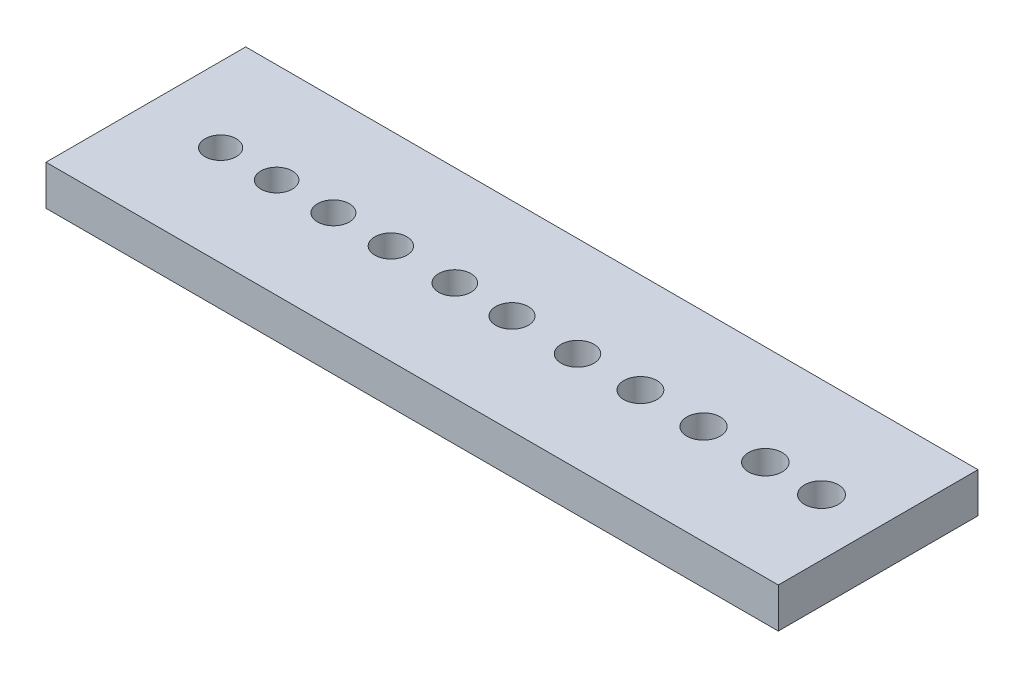
ISO-10303-21;
HEADER;
FILE_DESCRIPTION(('STEP AP214'),'2;1');
FILE_NAME('part.step','',(''),(''),'','','');
FILE_SCHEMA(('AUTOMOTIVE_DESIGN { 1 0 10303 214 1 1 1 1 }'));
ENDSEC;
DATA;
#1=APPLICATION_CONTEXT('core data for automotive mechanical design processes');
#2=APPLICATION_PROTOCOL_DEFINITION('international standard','automotive_design',2000,#1);
#3=PRODUCT_CONTEXT('',#1,'mechanical');
#4=PRODUCT('Part','Part','',(#3));
#5=PRODUCT_RELATED_PRODUCT_CATEGORY('part','',(#4));
#6=PRODUCT_DEFINITION_FORMATION('','',#4);
#7=PRODUCT_DEFINITION_CONTEXT('part definition',#1,'design');
#8=PRODUCT_DEFINITION('design','',#6,#7);
#9=PRODUCT_DEFINITION_SHAPE('','',#8);
#10=(LENGTH_UNIT() NAMED_UNIT(*) SI_UNIT(.MILLI.,.METRE.));
#11=(NAMED_UNIT(*) PLANE_ANGLE_UNIT() SI_UNIT($,.RADIAN.));
#12=(NAMED_UNIT(*) SI_UNIT($,.STERADIAN.) SOLID_ANGLE_UNIT());
#13=UNCERTAINTY_MEASURE_WITH_UNIT(LENGTH_MEASURE(1.E-05),#10,'distance_accuracy_value','');
#14=(GEOMETRIC_REPRESENTATION_CONTEXT(3) GLOBAL_UNCERTAINTY_ASSIGNED_CONTEXT((#13)) GLOBAL_UNIT_ASSIGNED_CONTEXT((#10,
#11,#12)) REPRESENTATION_CONTEXT('',''));
#15=CARTESIAN_POINT('',(0.,0.,0.));
#16=DIRECTION('',(0.,0.,1.));
#17=DIRECTION('',(1.,0.,0.));
#18=AXIS2_PLACEMENT_3D('',#15,#16,#17);
#19=CARTESIAN_POINT('',(0.,3.,0.));
#20=DIRECTION('',(0.,-1.,0.));
#21=DIRECTION('',(0.,0.,-1.));
#22=AXIS2_PLACEMENT_3D('',#19,#20,#21);
#23=PLANE('',#22);
#24=DIRECTION('',(0.,0.,-1.));
#25=VECTOR('',#24,1.);
#26=CARTESIAN_POINT('',(27.5,3.,7.50000000000001));
#27=LINE('',#26,#25);
#28=CARTESIAN_POINT('',(27.5,3.,7.50000000000001));
#29=VERTEX_POINT('',#28);
#30=CARTESIAN_POINT('',(27.5,3.,-7.49999999999999));
#31=VERTEX_POINT('',#30);
#32=EDGE_CURVE('E94',#29,#31,#27,.T.);
#33=ORIENTED_EDGE('',*,*,#32,.T.);
#34=DIRECTION('',(-1.,0.,0.));
#35=VECTOR('',#34,1.);
#36=CARTESIAN_POINT('',(-27.5,3.,-7.50000000000001));
#37=LINE('',#36,#35);
#38=CARTESIAN_POINT('',(-27.5,3.,-7.50000000000001));
#39=VERTEX_POINT('',#38);
#40=EDGE_CURVE('E89',#31,#39,#37,.T.);
#41=ORIENTED_EDGE('',*,*,#40,.T.);
#42=DIRECTION('',(0.,0.,1.));
#43=VECTOR('',#42,1.);
#44=CARTESIAN_POINT('',(-27.5,3.,7.50000000000001));
#45=LINE('',#44,#43);
#46=CARTESIAN_POINT('',(-27.5,3.,7.50000000000001));
#47=VERTEX_POINT('',#46);
#48=EDGE_CURVE('E92',#39,#47,#45,.T.);
#49=ORIENTED_EDGE('',*,*,#48,.T.);
#50=DIRECTION('',(1.,0.,0.));
#51=VECTOR('',#50,1.);
#52=CARTESIAN_POINT('',(-27.5,3.,7.50000000000001));
#53=LINE('',#52,#51);
#54=EDGE_CURVE('E59',#47,#29,#53,.T.);
#55=ORIENTED_EDGE('',*,*,#54,.T.);
#56=EDGE_LOOP('',(#33,#41,#49,#55));
#57=FACE_BOUND('',#56,.T.);
#58=CARTESIAN_POINT('',(-21.8853710496883,3.,0.));
#59=DIRECTION('',(0.,1.,0.));
#60=DIRECTION('',(0.,0.,1.));
#61=AXIS2_PLACEMENT_3D('',#58,#59,#60);
#62=CIRCLE('',#61,1.175);
#63=CARTESIAN_POINT('',(-21.8853710496883,3.,1.175));
#64=VERTEX_POINT('',#63);
#65=EDGE_CURVE('E114',#64,#64,#62,.T.);
#66=ORIENTED_EDGE('',*,*,#65,.F.);
#67=EDGE_LOOP('',(#66));
#68=FACE_BOUND('',#67,.T.);
#69=CARTESIAN_POINT('',(-17.6786072441583,3.,0.));
#70=DIRECTION('',(0.,1.,0.));
#71=DIRECTION('',(0.,0.,1.));
#72=AXIS2_PLACEMENT_3D('',#69,#70,#71);
#73=CIRCLE('',#72,1.185);
#74=CARTESIAN_POINT('',(-17.6786072441583,3.,1.185));
#75=VERTEX_POINT('',#74);
#76=EDGE_CURVE('E136',#75,#75,#73,.T.);
#77=ORIENTED_EDGE('',*,*,#76,.F.);
#78=EDGE_LOOP('',(#77));
#79=FACE_BOUND('',#78,.T.);
#80=CARTESIAN_POINT('',(-13.4135496001551,3.,0.));
#81=DIRECTION('',(0.,1.,0.));
#82=DIRECTION('',(0.,0.,1.));
#83=AXIS2_PLACEMENT_3D('',#80,#81,#82);
#84=CIRCLE('',#83,1.195);
#85=CARTESIAN_POINT('',(-13.4135496001551,3.,1.195));
#86=VERTEX_POINT('',#85);
#87=EDGE_CURVE('E144',#86,#86,#84,.T.);
#88=ORIENTED_EDGE('',*,*,#87,.F.);
#89=EDGE_LOOP('',(#88));
#90=FACE_BOUND('',#89,.T.);
#91=CARTESIAN_POINT('',(-9.09946830507138,3.,0.));
#92=DIRECTION('',(0.,1.,0.));
#93=DIRECTION('',(0.,0.,1.));
#94=AXIS2_PLACEMENT_3D('',#91,#92,#93);
#95=CIRCLE('',#94,1.205);
#96=CARTESIAN_POINT('',(-9.09946830507138,3.,1.205));
#97=VERTEX_POINT('',#96);
#98=EDGE_CURVE('E152',#97,#97,#95,.T.);
#99=ORIENTED_EDGE('',*,*,#98,.F.);
#100=EDGE_LOOP('',(#99));
#101=FACE_BOUND('',#100,.T.);
#102=CARTESIAN_POINT('',(-4.29515049918267,3.,0.));
#103=DIRECTION('',(0.,1.,0.));
#104=DIRECTION('',(0.,0.,1.));
#105=AXIS2_PLACEMENT_3D('',#102,#103,#104);
#106=CIRCLE('',#105,1.215);
#107=CARTESIAN_POINT('',(-4.29515049918267,3.,1.215));
#108=VERTEX_POINT('',#107);
#109=EDGE_CURVE('E160',#108,#108,#106,.T.);
#110=ORIENTED_EDGE('',*,*,#109,.F.);
#111=EDGE_LOOP('',(#110));
#112=FACE_BOUND('',#111,.T.);
#113=CARTESIAN_POINT('',(0.,3.,0.));
#114=DIRECTION('',(0.,1.,0.));
#115=DIRECTION('',(0.,0.,1.));
#116=AXIS2_PLACEMENT_3D('',#113,#114,#115);
#117=CIRCLE('',#116,1.225);
#118=CARTESIAN_POINT('',(0.,3.,1.225));
#119=VERTEX_POINT('',#118);
#120=EDGE_CURVE('E168',#119,#119,#117,.T.);
#121=ORIENTED_EDGE('',*,*,#120,.F.);
#122=EDGE_LOOP('',(#121));
#123=FACE_BOUND('',#122,.T.);
#124=CARTESIAN_POINT('',(4.92129590395075,3.,0.));
#125=DIRECTION('',(0.,1.,0.));
#126=DIRECTION('',(0.,0.,1.));
#127=AXIS2_PLACEMENT_3D('',#124,#125,#126);
#128=CIRCLE('',#127,1.235);
#129=CARTESIAN_POINT('',(4.92129590395075,3.,1.235));
#130=VERTEX_POINT('',#129);
#131=EDGE_CURVE('E176',#130,#130,#128,.T.);
#132=ORIENTED_EDGE('',*,*,#131,.F.);
#133=EDGE_LOOP('',(#132));
#134=FACE_BOUND('',#133,.T.);
#135=CARTESIAN_POINT('',(14.3865256798599,3.,0.));
#136=DIRECTION('',(0.,1.,0.));
#137=DIRECTION('',(0.,0.,1.));
#138=AXIS2_PLACEMENT_3D('',#135,#136,#137);
#139=CIRCLE('',#138,1.255);
#140=CARTESIAN_POINT('',(14.3865256798599,3.,1.255));
#141=VERTEX_POINT('',#140);
#142=EDGE_CURVE('E184',#141,#141,#139,.T.);
#143=ORIENTED_EDGE('',*,*,#142,.F.);
#144=EDGE_LOOP('',(#143));
#145=FACE_BOUND('',#144,.T.);
#146=CARTESIAN_POINT('',(23.2453104518648,3.,0.));
#147=DIRECTION('',(0.,1.,0.));
#148=DIRECTION('',(0.,0.,1.));
#149=AXIS2_PLACEMENT_3D('',#146,#147,#148);
#150=CIRCLE('',#149,1.275);
#151=CARTESIAN_POINT('',(23.2453104518648,3.,1.275));
#152=VERTEX_POINT('',#151);
#153=EDGE_CURVE('E192',#152,#152,#150,.T.);
#154=ORIENTED_EDGE('',*,*,#153,.F.);
#155=EDGE_LOOP('',(#154));
#156=FACE_BOUND('',#155,.T.);
#157=CARTESIAN_POINT('',(9.64365409529866,3.,0.));
#158=DIRECTION('',(0.,1.,0.));
#159=DIRECTION('',(0.,0.,1.));
#160=AXIS2_PLACEMENT_3D('',#157,#158,#159);
#161=CIRCLE('',#160,1.245);
#162=CARTESIAN_POINT('',(9.64365409529866,3.,1.245));
#163=VERTEX_POINT('',#162);
#164=EDGE_CURVE('E200',#163,#163,#161,.T.);
#165=ORIENTED_EDGE('',*,*,#164,.F.);
#166=EDGE_LOOP('',(#165));
#167=FACE_BOUND('',#166,.T.);
#168=CARTESIAN_POINT('',(19.028560126503,3.,0.));
#169=DIRECTION('',(0.,1.,0.));
#170=DIRECTION('',(0.,0.,1.));
#171=AXIS2_PLACEMENT_3D('',#168,#169,#170);
#172=CIRCLE('',#171,1.265);
#173=CARTESIAN_POINT('',(19.028560126503,3.,1.265));
#174=VERTEX_POINT('',#173);
#175=EDGE_CURVE('E208',#174,#174,#172,.T.);
#176=ORIENTED_EDGE('',*,*,#175,.F.);
#177=EDGE_LOOP('',(#176));
#178=FACE_BOUND('',#177,.T.);
#179=ADVANCED_FACE('F41',(#57,#68,#79,#90,#101,#112,#123,#134,#145,#156,#167,#178),#23,.F.);
#180=CARTESIAN_POINT('',(0.,0.,0.));
#181=DIRECTION('',(0.,-1.,0.));
#182=DIRECTION('',(0.,0.,-1.));
#183=AXIS2_PLACEMENT_3D('',#180,#181,#182);
#184=PLANE('',#183);
#185=CARTESIAN_POINT('',(9.64365409529866,0.,0.));
#186=DIRECTION('',(0.,1.,0.));
#187=DIRECTION('',(0.,0.,1.));
#188=AXIS2_PLACEMENT_3D('',#185,#186,#187);
#189=CIRCLE('',#188,1.245);
#190=CARTESIAN_POINT('',(9.64365409529866,0.,1.245));
#191=VERTEX_POINT('',#190);
#192=EDGE_CURVE('E204',#191,#191,#189,.T.);
#193=ORIENTED_EDGE('',*,*,#192,.T.);
#194=EDGE_LOOP('',(#193));
#195=FACE_BOUND('',#194,.T.);
#196=CARTESIAN_POINT('',(14.3865256798599,0.,0.));
#197=DIRECTION('',(0.,1.,0.));
#198=DIRECTION('',(0.,0.,1.));
#199=AXIS2_PLACEMENT_3D('',#196,#197,#198);
#200=CIRCLE('',#199,1.255);
#201=CARTESIAN_POINT('',(14.3865256798599,0.,1.255));
#202=VERTEX_POINT('',#201);
#203=EDGE_CURVE('E188',#202,#202,#200,.T.);
#204=ORIENTED_EDGE('',*,*,#203,.T.);
#205=EDGE_LOOP('',(#204));
#206=FACE_BOUND('',#205,.T.);
#207=CARTESIAN_POINT('',(0.,0.,0.));
#208=DIRECTION('',(0.,1.,0.));
#209=DIRECTION('',(0.,0.,1.));
#210=AXIS2_PLACEMENT_3D('',#207,#208,#209);
#211=CIRCLE('',#210,1.225);
#212=CARTESIAN_POINT('',(0.,0.,1.225));
#213=VERTEX_POINT('',#212);
#214=EDGE_CURVE('E172',#213,#213,#211,.T.);
#215=ORIENTED_EDGE('',*,*,#214,.T.);
#216=EDGE_LOOP('',(#215));
#217=FACE_BOUND('',#216,.T.);
#218=CARTESIAN_POINT('',(-9.09946830507138,0.,0.));
#219=DIRECTION('',(0.,1.,0.));
#220=DIRECTION('',(0.,0.,1.));
#221=AXIS2_PLACEMENT_3D('',#218,#219,#220);
#222=CIRCLE('',#221,1.205);
#223=CARTESIAN_POINT('',(-9.09946830507138,0.,1.205));
#224=VERTEX_POINT('',#223);
#225=EDGE_CURVE('E156',#224,#224,#222,.T.);
#226=ORIENTED_EDGE('',*,*,#225,.T.);
#227=EDGE_LOOP('',(#226));
#228=FACE_BOUND('',#227,.T.);
#229=CARTESIAN_POINT('',(-17.6786072441583,0.,0.));
#230=DIRECTION('',(0.,1.,0.));
#231=DIRECTION('',(0.,0.,1.));
#232=AXIS2_PLACEMENT_3D('',#229,#230,#231);
#233=CIRCLE('',#232,1.185);
#234=CARTESIAN_POINT('',(-17.6786072441583,0.,1.185));
#235=VERTEX_POINT('',#234);
#236=EDGE_CURVE('E140',#235,#235,#233,.T.);
#237=ORIENTED_EDGE('',*,*,#236,.T.);
#238=EDGE_LOOP('',(#237));
#239=FACE_BOUND('',#238,.T.);
#240=DIRECTION('',(0.,0.,-1.));
#241=VECTOR('',#240,1.);
#242=CARTESIAN_POINT('',(27.5,0.,7.50000000000001));
#243=LINE('',#242,#241);
#244=CARTESIAN_POINT('',(27.5,0.,7.50000000000001));
#245=VERTEX_POINT('',#244);
#246=CARTESIAN_POINT('',(27.5,0.,-7.49999999999999));
#247=VERTEX_POINT('',#246);
#248=EDGE_CURVE('E110',#245,#247,#243,.T.);
#249=ORIENTED_EDGE('',*,*,#248,.F.);
#250=DIRECTION('',(1.,0.,0.));
#251=VECTOR('',#250,1.);
#252=CARTESIAN_POINT('',(-27.5,0.,7.50000000000001));
#253=LINE('',#252,#251);
#254=CARTESIAN_POINT('',(-27.5,0.,7.50000000000001));
#255=VERTEX_POINT('',#254);
#256=EDGE_CURVE('E82',#255,#245,#253,.T.);
#257=ORIENTED_EDGE('',*,*,#256,.F.);
#258=DIRECTION('',(0.,0.,1.));
#259=VECTOR('',#258,1.);
#260=CARTESIAN_POINT('',(-27.5,0.,7.50000000000001));
#261=LINE('',#260,#259);
#262=CARTESIAN_POINT('',(-27.5,0.,-7.50000000000001));
#263=VERTEX_POINT('',#262);
#264=EDGE_CURVE('E76',#263,#255,#261,.T.);
#265=ORIENTED_EDGE('',*,*,#264,.F.);
#266=DIRECTION('',(-1.,0.,0.));
#267=VECTOR('',#266,1.);
#268=CARTESIAN_POINT('',(-27.5,0.,-7.50000000000001));
#269=LINE('',#268,#267);
#270=EDGE_CURVE('E99',#247,#263,#269,.T.);
#271=ORIENTED_EDGE('',*,*,#270,.F.);
#272=EDGE_LOOP('',(#249,#257,#265,#271));
#273=FACE_BOUND('',#272,.T.);
#274=CARTESIAN_POINT('',(-21.8853710496883,0.,0.));
#275=DIRECTION('',(0.,1.,0.));
#276=DIRECTION('',(0.,0.,1.));
#277=AXIS2_PLACEMENT_3D('',#274,#275,#276);
#278=CIRCLE('',#277,1.175);
#279=CARTESIAN_POINT('',(-21.8853710496883,0.,1.175));
#280=VERTEX_POINT('',#279);
#281=EDGE_CURVE('E132',#280,#280,#278,.T.);
#282=ORIENTED_EDGE('',*,*,#281,.T.);
#283=EDGE_LOOP('',(#282));
#284=FACE_BOUND('',#283,.T.);
#285=CARTESIAN_POINT('',(-13.4135496001551,0.,0.));
#286=DIRECTION('',(0.,1.,0.));
#287=DIRECTION('',(0.,0.,1.));
#288=AXIS2_PLACEMENT_3D('',#285,#286,#287);
#289=CIRCLE('',#288,1.195);
#290=CARTESIAN_POINT('',(-13.4135496001551,0.,1.195));
#291=VERTEX_POINT('',#290);
#292=EDGE_CURVE('E148',#291,#291,#289,.T.);
#293=ORIENTED_EDGE('',*,*,#292,.T.);
#294=EDGE_LOOP('',(#293));
#295=FACE_BOUND('',#294,.T.);
#296=CARTESIAN_POINT('',(-4.29515049918267,0.,0.));
#297=DIRECTION('',(0.,1.,0.));
#298=DIRECTION('',(0.,0.,1.));
#299=AXIS2_PLACEMENT_3D('',#296,#297,#298);
#300=CIRCLE('',#299,1.215);
#301=CARTESIAN_POINT('',(-4.29515049918267,0.,1.215));
#302=VERTEX_POINT('',#301);
#303=EDGE_CURVE('E164',#302,#302,#300,.T.);
#304=ORIENTED_EDGE('',*,*,#303,.T.);
#305=EDGE_LOOP('',(#304));
#306=FACE_BOUND('',#305,.T.);
#307=CARTESIAN_POINT('',(4.92129590395075,0.,0.));
#308=DIRECTION('',(0.,1.,0.));
#309=DIRECTION('',(0.,0.,1.));
#310=AXIS2_PLACEMENT_3D('',#307,#308,#309);
#311=CIRCLE('',#310,1.235);
#312=CARTESIAN_POINT('',(4.92129590395075,0.,1.235));
#313=VERTEX_POINT('',#312);
#314=EDGE_CURVE('E180',#313,#313,#311,.T.);
#315=ORIENTED_EDGE('',*,*,#314,.T.);
#316=EDGE_LOOP('',(#315));
#317=FACE_BOUND('',#316,.T.);
#318=CARTESIAN_POINT('',(23.2453104518648,0.,0.));
#319=DIRECTION('',(0.,1.,0.));
#320=DIRECTION('',(0.,0.,1.));
#321=AXIS2_PLACEMENT_3D('',#318,#319,#320);
#322=CIRCLE('',#321,1.275);
#323=CARTESIAN_POINT('',(23.2453104518648,0.,1.275));
#324=VERTEX_POINT('',#323);
#325=EDGE_CURVE('E196',#324,#324,#322,.T.);
#326=ORIENTED_EDGE('',*,*,#325,.T.);
#327=EDGE_LOOP('',(#326));
#328=FACE_BOUND('',#327,.T.);
#329=CARTESIAN_POINT('',(19.028560126503,0.,0.));
#330=DIRECTION('',(0.,1.,0.));
#331=DIRECTION('',(0.,0.,1.));
#332=AXIS2_PLACEMENT_3D('',#329,#330,#331);
#333=CIRCLE('',#332,1.265);
#334=CARTESIAN_POINT('',(19.028560126503,0.,1.265));
#335=VERTEX_POINT('',#334);
#336=EDGE_CURVE('E212',#335,#335,#333,.T.);
#337=ORIENTED_EDGE('',*,*,#336,.T.);
#338=EDGE_LOOP('',(#337));
#339=FACE_BOUND('',#338,.T.);
#340=ADVANCED_FACE('F127',(#195,#206,#217,#228,#239,#273,#284,#295,#306,#317,#328,#339),#184,.T.);
#341=CARTESIAN_POINT('',(27.5,3.,7.50000000000001));
#342=DIRECTION('',(-1.,0.,0.));
#343=DIRECTION('',(0.,0.,1.));
#344=AXIS2_PLACEMENT_3D('',#341,#342,#343);
#345=PLANE('',#344);
#346=ORIENTED_EDGE('',*,*,#248,.T.);
#347=DIRECTION('',(0.,-1.,0.));
#348=VECTOR('',#347,1.);
#349=CARTESIAN_POINT('',(27.5,3.,-7.49999999999999));
#350=LINE('',#349,#348);
#351=EDGE_CURVE('E11',#31,#247,#350,.T.);
#352=ORIENTED_EDGE('',*,*,#351,.F.);
#353=ORIENTED_EDGE('',*,*,#32,.F.);
#354=DIRECTION('',(0.,-1.,0.));
#355=VECTOR('',#354,1.);
#356=CARTESIAN_POINT('',(27.5,3.,7.50000000000001));
#357=LINE('',#356,#355);
#358=EDGE_CURVE('E106',#29,#245,#357,.T.);
#359=ORIENTED_EDGE('',*,*,#358,.T.);
#360=EDGE_LOOP('',(#346,#352,#353,#359));
#361=FACE_BOUND('',#360,.T.);
#362=ADVANCED_FACE('F43',(#361),#345,.F.);
#363=CARTESIAN_POINT('',(-27.5,3.,-7.50000000000001));
#364=DIRECTION('',(0.,0.,1.));
#365=DIRECTION('',(1.,0.,0.));
#366=AXIS2_PLACEMENT_3D('',#363,#364,#365);
#367=PLANE('',#366);
#368=ORIENTED_EDGE('',*,*,#270,.T.);
#369=DIRECTION('',(0.,-1.,0.));
#370=VECTOR('',#369,1.);
#371=CARTESIAN_POINT('',(-27.5,3.,-7.50000000000001));
#372=LINE('',#371,#370);
#373=EDGE_CURVE('E51',#39,#263,#372,.T.);
#374=ORIENTED_EDGE('',*,*,#373,.F.);
#375=ORIENTED_EDGE('',*,*,#40,.F.);
#376=ORIENTED_EDGE('',*,*,#351,.T.);
#377=EDGE_LOOP('',(#368,#374,#375,#376));
#378=FACE_BOUND('',#377,.T.);
#379=ADVANCED_FACE('F98',(#378),#367,.F.);
#380=CARTESIAN_POINT('',(-27.5,3.,7.50000000000001));
#381=DIRECTION('',(1.,0.,0.));
#382=DIRECTION('',(0.,0.,-1.));
#383=AXIS2_PLACEMENT_3D('',#380,#381,#382);
#384=PLANE('',#383);
#385=ORIENTED_EDGE('',*,*,#264,.T.);
#386=DIRECTION('',(0.,-1.,0.));
#387=VECTOR('',#386,1.);
#388=CARTESIAN_POINT('',(-27.5,3.,7.50000000000001));
#389=LINE('',#388,#387);
#390=EDGE_CURVE('E101',#47,#255,#389,.T.);
#391=ORIENTED_EDGE('',*,*,#390,.F.);
#392=ORIENTED_EDGE('',*,*,#48,.F.);
#393=ORIENTED_EDGE('',*,*,#373,.T.);
#394=EDGE_LOOP('',(#385,#391,#392,#393));
#395=FACE_BOUND('',#394,.T.);
#396=ADVANCED_FACE('F102',(#395),#384,.F.);
#397=CARTESIAN_POINT('',(-27.5,3.,7.50000000000001));
#398=DIRECTION('',(0.,0.,-1.));
#399=DIRECTION('',(-1.,0.,0.));
#400=AXIS2_PLACEMENT_3D('',#397,#398,#399);
#401=PLANE('',#400);
#402=ORIENTED_EDGE('',*,*,#256,.T.);
#403=ORIENTED_EDGE('',*,*,#358,.F.);
#404=ORIENTED_EDGE('',*,*,#54,.F.);
#405=ORIENTED_EDGE('',*,*,#390,.T.);
#406=EDGE_LOOP('',(#402,#403,#404,#405));
#407=FACE_BOUND('',#406,.T.);
#408=ADVANCED_FACE('F124',(#407),#401,.F.);
#409=CARTESIAN_POINT('',(-21.8853710496883,3.,0.));
#410=DIRECTION('',(0.,-1.,0.));
#411=DIRECTION('',(0.,0.,-1.));
#412=AXIS2_PLACEMENT_3D('',#409,#410,#411);
#413=CYLINDRICAL_SURFACE('',#412,1.175);
#414=ORIENTED_EDGE('',*,*,#65,.T.);
#415=EDGE_LOOP('',(#414));
#416=FACE_BOUND('',#415,.T.);
#417=ORIENTED_EDGE('',*,*,#281,.F.);
#418=EDGE_LOOP('',(#417));
#419=FACE_BOUND('',#418,.T.);
#420=ADVANCED_FACE('F231',(#416,#419),#413,.F.);
#421=CARTESIAN_POINT('',(-17.6786072441583,3.,0.));
#422=DIRECTION('',(0.,-1.,0.));
#423=DIRECTION('',(0.,0.,-1.));
#424=AXIS2_PLACEMENT_3D('',#421,#422,#423);
#425=CYLINDRICAL_SURFACE('',#424,1.185);
#426=ORIENTED_EDGE('',*,*,#76,.T.);
#427=EDGE_LOOP('',(#426));
#428=FACE_BOUND('',#427,.T.);
#429=ORIENTED_EDGE('',*,*,#236,.F.);
#430=EDGE_LOOP('',(#429));
#431=FACE_BOUND('',#430,.T.);
#432=ADVANCED_FACE('F283',(#428,#431),#425,.F.);
#433=CARTESIAN_POINT('',(-13.4135496001551,3.,0.));
#434=DIRECTION('',(0.,-1.,0.));
#435=DIRECTION('',(0.,0.,-1.));
#436=AXIS2_PLACEMENT_3D('',#433,#434,#435);
#437=CYLINDRICAL_SURFACE('',#436,1.195);
#438=ORIENTED_EDGE('',*,*,#87,.T.);
#439=EDGE_LOOP('',(#438));
#440=FACE_BOUND('',#439,.T.);
#441=ORIENTED_EDGE('',*,*,#292,.F.);
#442=EDGE_LOOP('',(#441));
#443=FACE_BOUND('',#442,.T.);
#444=ADVANCED_FACE('F292',(#440,#443),#437,.F.);
#445=CARTESIAN_POINT('',(-9.09946830507138,3.,0.));
#446=DIRECTION('',(0.,-1.,0.));
#447=DIRECTION('',(0.,0.,-1.));
#448=AXIS2_PLACEMENT_3D('',#445,#446,#447);
#449=CYLINDRICAL_SURFACE('',#448,1.205);
#450=ORIENTED_EDGE('',*,*,#98,.T.);
#451=EDGE_LOOP('',(#450));
#452=FACE_BOUND('',#451,.T.);
#453=ORIENTED_EDGE('',*,*,#225,.F.);
#454=EDGE_LOOP('',(#453));
#455=FACE_BOUND('',#454,.T.);
#456=ADVANCED_FACE('F301',(#452,#455),#449,.F.);
#457=CARTESIAN_POINT('',(-4.29515049918267,3.,0.));
#458=DIRECTION('',(0.,-1.,0.));
#459=DIRECTION('',(0.,0.,-1.));
#460=AXIS2_PLACEMENT_3D('',#457,#458,#459);
#461=CYLINDRICAL_SURFACE('',#460,1.215);
#462=ORIENTED_EDGE('',*,*,#109,.T.);
#463=EDGE_LOOP('',(#462));
#464=FACE_BOUND('',#463,.T.);
#465=ORIENTED_EDGE('',*,*,#303,.F.);
#466=EDGE_LOOP('',(#465));
#467=FACE_BOUND('',#466,.T.);
#468=ADVANCED_FACE('F311',(#464,#467),#461,.F.);
#469=CARTESIAN_POINT('',(0.,3.,0.));
#470=DIRECTION('',(0.,-1.,0.));
#471=DIRECTION('',(0.,0.,-1.));
#472=AXIS2_PLACEMENT_3D('',#469,#470,#471);
#473=CYLINDRICAL_SURFACE('',#472,1.225);
#474=ORIENTED_EDGE('',*,*,#120,.T.);
#475=EDGE_LOOP('',(#474));
#476=FACE_BOUND('',#475,.T.);
#477=ORIENTED_EDGE('',*,*,#214,.F.);
#478=EDGE_LOOP('',(#477));
#479=FACE_BOUND('',#478,.T.);
#480=ADVANCED_FACE('F321',(#476,#479),#473,.F.);
#481=CARTESIAN_POINT('',(4.92129590395075,3.,0.));
#482=DIRECTION('',(0.,-1.,0.));
#483=DIRECTION('',(0.,0.,-1.));
#484=AXIS2_PLACEMENT_3D('',#481,#482,#483);
#485=CYLINDRICAL_SURFACE('',#484,1.235);
#486=ORIENTED_EDGE('',*,*,#131,.T.);
#487=EDGE_LOOP('',(#486));
#488=FACE_BOUND('',#487,.T.);
#489=ORIENTED_EDGE('',*,*,#314,.F.);
#490=EDGE_LOOP('',(#489));
#491=FACE_BOUND('',#490,.T.);
#492=ADVANCED_FACE('F331',(#488,#491),#485,.F.);
#493=CARTESIAN_POINT('',(14.3865256798599,3.,0.));
#494=DIRECTION('',(0.,-1.,0.));
#495=DIRECTION('',(0.,0.,-1.));
#496=AXIS2_PLACEMENT_3D('',#493,#494,#495);
#497=CYLINDRICAL_SURFACE('',#496,1.255);
#498=ORIENTED_EDGE('',*,*,#142,.T.);
#499=EDGE_LOOP('',(#498));
#500=FACE_BOUND('',#499,.T.);
#501=ORIENTED_EDGE('',*,*,#203,.F.);
#502=EDGE_LOOP('',(#501));
#503=FACE_BOUND('',#502,.T.);
#504=ADVANCED_FACE('F341',(#500,#503),#497,.F.);
#505=CARTESIAN_POINT('',(23.2453104518648,3.,0.));
#506=DIRECTION('',(0.,-1.,0.));
#507=DIRECTION('',(0.,0.,-1.));
#508=AXIS2_PLACEMENT_3D('',#505,#506,#507);
#509=CYLINDRICAL_SURFACE('',#508,1.275);
#510=ORIENTED_EDGE('',*,*,#153,.T.);
#511=EDGE_LOOP('',(#510));
#512=FACE_BOUND('',#511,.T.);
#513=ORIENTED_EDGE('',*,*,#325,.F.);
#514=EDGE_LOOP('',(#513));
#515=FACE_BOUND('',#514,.T.);
#516=ADVANCED_FACE('F351',(#512,#515),#509,.F.);
#517=CARTESIAN_POINT('',(9.64365409529866,3.,0.));
#518=DIRECTION('',(0.,-1.,0.));
#519=DIRECTION('',(0.,0.,-1.));
#520=AXIS2_PLACEMENT_3D('',#517,#518,#519);
#521=CYLINDRICAL_SURFACE('',#520,1.245);
#522=ORIENTED_EDGE('',*,*,#164,.T.);
#523=EDGE_LOOP('',(#522));
#524=FACE_BOUND('',#523,.T.);
#525=ORIENTED_EDGE('',*,*,#192,.F.);
#526=EDGE_LOOP('',(#525));
#527=FACE_BOUND('',#526,.T.);
#528=ADVANCED_FACE('F361',(#524,#527),#521,.F.);
#529=CARTESIAN_POINT('',(19.028560126503,3.,0.));
#530=DIRECTION('',(0.,-1.,0.));
#531=DIRECTION('',(0.,0.,-1.));
#532=AXIS2_PLACEMENT_3D('',#529,#530,#531);
#533=CYLINDRICAL_SURFACE('',#532,1.265);
#534=ORIENTED_EDGE('',*,*,#175,.T.);
#535=EDGE_LOOP('',(#534));
#536=FACE_BOUND('',#535,.T.);
#537=ORIENTED_EDGE('',*,*,#336,.F.);
#538=EDGE_LOOP('',(#537));
#539=FACE_BOUND('',#538,.T.);
#540=ADVANCED_FACE('F220',(#536,#539),#533,.F.);
#541=CLOSED_SHELL('',(#179,#340,#362,#379,#396,#408,#420,#432,#444,#456,#468,#480,#492,#504,
#516,#528,#540));
#542=MANIFOLD_SOLID_BREP('B2',#541);
#543=ADVANCED_BREP_SHAPE_REPRESENTATION('',(#18,#542),#14);
#544=SHAPE_DEFINITION_REPRESENTATION(#9,#543);
ENDSEC;
END-ISO-10303-21;
